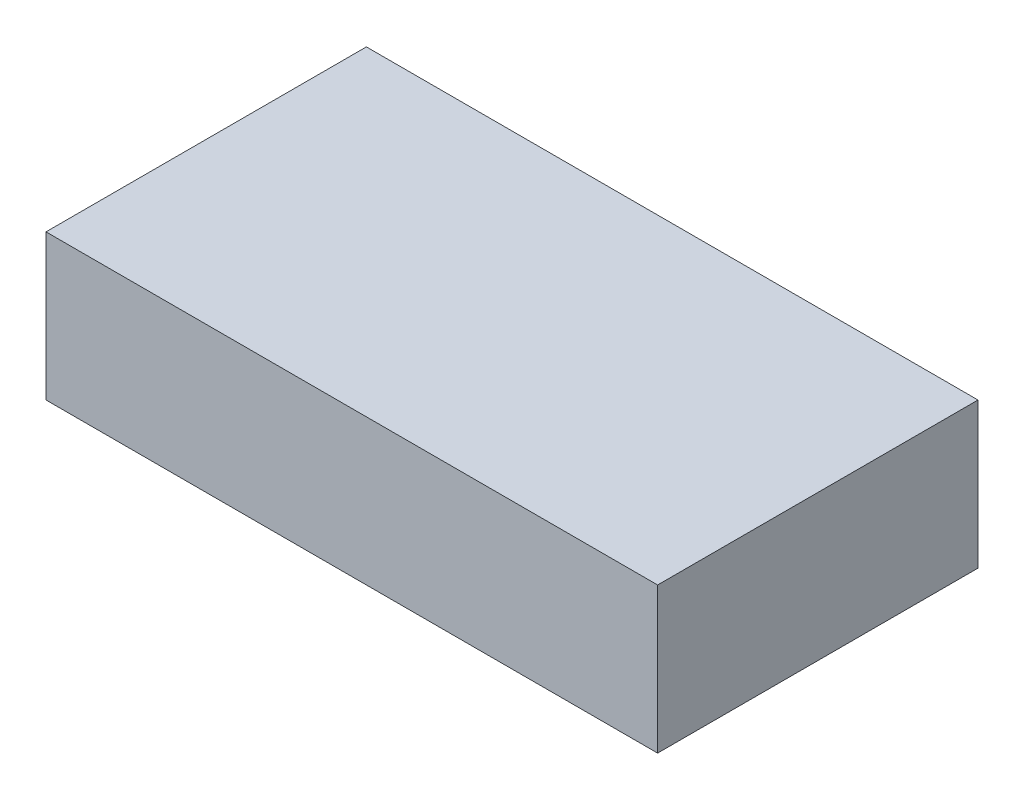
ISO-10303-21;
HEADER;
FILE_DESCRIPTION(('STEP AP214'),'2;1');
FILE_NAME('part.step','',(''),(''),'','','');
FILE_SCHEMA(('AUTOMOTIVE_DESIGN { 1 0 10303 214 1 1 1 1 }'));
ENDSEC;
DATA;
#1=APPLICATION_CONTEXT('core data for automotive mechanical design processes');
#2=APPLICATION_PROTOCOL_DEFINITION('international standard','automotive_design',2000,#1);
#3=PRODUCT_CONTEXT('',#1,'mechanical');
#4=PRODUCT('Part','Part','',(#3));
#5=PRODUCT_RELATED_PRODUCT_CATEGORY('part','',(#4));
#6=PRODUCT_DEFINITION_FORMATION('','',#4);
#7=PRODUCT_DEFINITION_CONTEXT('part definition',#1,'design');
#8=PRODUCT_DEFINITION('design','',#6,#7);
#9=PRODUCT_DEFINITION_SHAPE('','',#8);
#10=(LENGTH_UNIT() NAMED_UNIT(*) SI_UNIT(.MILLI.,.METRE.));
#11=(NAMED_UNIT(*) PLANE_ANGLE_UNIT() SI_UNIT($,.RADIAN.));
#12=(NAMED_UNIT(*) SI_UNIT($,.STERADIAN.) SOLID_ANGLE_UNIT());
#13=UNCERTAINTY_MEASURE_WITH_UNIT(LENGTH_MEASURE(1.E-05),#10,'distance_accuracy_value','');
#14=(GEOMETRIC_REPRESENTATION_CONTEXT(3) GLOBAL_UNCERTAINTY_ASSIGNED_CONTEXT((#13)) GLOBAL_UNIT_ASSIGNED_CONTEXT((#10,
#11,#12)) REPRESENTATION_CONTEXT('',''));
#15=CARTESIAN_POINT('',(0.,0.,0.));
#16=DIRECTION('',(0.,0.,1.));
#17=DIRECTION('',(1.,0.,0.));
#18=AXIS2_PLACEMENT_3D('',#15,#16,#17);
#19=CARTESIAN_POINT('',(0.,25.,-55.));
#20=DIRECTION('',(1.,0.,0.));
#21=DIRECTION('',(0.,0.,-1.));
#22=AXIS2_PLACEMENT_3D('',#19,#20,#21);
#23=PLANE('',#22);
#24=DIRECTION('',(0.,0.,1.));
#25=VECTOR('',#24,1.);
#26=CARTESIAN_POINT('',(0.,0.,-55.));
#27=LINE('',#26,#25);
#28=CARTESIAN_POINT('',(0.,0.,-55.));
#29=VERTEX_POINT('',#28);
#30=CARTESIAN_POINT('',(0.,0.,0.));
#31=VERTEX_POINT('',#30);
#32=EDGE_CURVE('E107',#29,#31,#27,.T.);
#33=ORIENTED_EDGE('',*,*,#32,.T.);
#34=DIRECTION('',(0.,-1.,0.));
#35=VECTOR('',#34,1.);
#36=CARTESIAN_POINT('',(0.,25.,0.));
#37=LINE('',#36,#35);
#38=CARTESIAN_POINT('',(0.,25.,0.));
#39=VERTEX_POINT('',#38);
#40=EDGE_CURVE('E11',#39,#31,#37,.T.);
#41=ORIENTED_EDGE('',*,*,#40,.F.);
#42=DIRECTION('',(0.,0.,1.));
#43=VECTOR('',#42,1.);
#44=CARTESIAN_POINT('',(0.,25.,-55.));
#45=LINE('',#44,#43);
#46=CARTESIAN_POINT('',(0.,25.,-55.));
#47=VERTEX_POINT('',#46);
#48=EDGE_CURVE('E91',#47,#39,#45,.T.);
#49=ORIENTED_EDGE('',*,*,#48,.F.);
#50=DIRECTION('',(0.,-1.,0.));
#51=VECTOR('',#50,1.);
#52=CARTESIAN_POINT('',(0.,25.,-55.));
#53=LINE('',#52,#51);
#54=EDGE_CURVE('E103',#47,#29,#53,.T.);
#55=ORIENTED_EDGE('',*,*,#54,.T.);
#56=EDGE_LOOP('',(#33,#41,#49,#55));
#57=FACE_BOUND('',#56,.T.);
#58=ADVANCED_FACE('F39',(#57),#23,.F.);
#59=CARTESIAN_POINT('',(0.,25.,0.));
#60=DIRECTION('',(0.,0.,-1.));
#61=DIRECTION('',(-1.,0.,0.));
#62=AXIS2_PLACEMENT_3D('',#59,#60,#61);
#63=PLANE('',#62);
#64=DIRECTION('',(1.,0.,0.));
#65=VECTOR('',#64,1.);
#66=CARTESIAN_POINT('',(0.,0.,0.));
#67=LINE('',#66,#65);
#68=CARTESIAN_POINT('',(105.,0.,0.));
#69=VERTEX_POINT('',#68);
#70=EDGE_CURVE('E96',#31,#69,#67,.T.);
#71=ORIENTED_EDGE('',*,*,#70,.T.);
#72=DIRECTION('',(0.,-1.,0.));
#73=VECTOR('',#72,1.);
#74=CARTESIAN_POINT('',(105.,25.,0.));
#75=LINE('',#74,#73);
#76=CARTESIAN_POINT('',(105.,25.,0.));
#77=VERTEX_POINT('',#76);
#78=EDGE_CURVE('E48',#77,#69,#75,.T.);
#79=ORIENTED_EDGE('',*,*,#78,.F.);
#80=DIRECTION('',(1.,0.,0.));
#81=VECTOR('',#80,1.);
#82=CARTESIAN_POINT('',(0.,25.,0.));
#83=LINE('',#82,#81);
#84=EDGE_CURVE('E86',#39,#77,#83,.T.);
#85=ORIENTED_EDGE('',*,*,#84,.F.);
#86=ORIENTED_EDGE('',*,*,#40,.T.);
#87=EDGE_LOOP('',(#71,#79,#85,#86));
#88=FACE_BOUND('',#87,.T.);
#89=ADVANCED_FACE('F95',(#88),#63,.F.);
#90=CARTESIAN_POINT('',(105.,25.,0.));
#91=DIRECTION('',(-1.,0.,0.));
#92=DIRECTION('',(0.,0.,1.));
#93=AXIS2_PLACEMENT_3D('',#90,#91,#92);
#94=PLANE('',#93);
#95=DIRECTION('',(0.,0.,-1.));
#96=VECTOR('',#95,1.);
#97=CARTESIAN_POINT('',(105.,0.,0.));
#98=LINE('',#97,#96);
#99=CARTESIAN_POINT('',(105.,0.,-55.));
#100=VERTEX_POINT('',#99);
#101=EDGE_CURVE('E73',#69,#100,#98,.T.);
#102=ORIENTED_EDGE('',*,*,#101,.T.);
#103=DIRECTION('',(0.,-1.,0.));
#104=VECTOR('',#103,1.);
#105=CARTESIAN_POINT('',(105.,25.,-55.));
#106=LINE('',#105,#104);
#107=CARTESIAN_POINT('',(105.,25.,-55.));
#108=VERTEX_POINT('',#107);
#109=EDGE_CURVE('E98',#108,#100,#106,.T.);
#110=ORIENTED_EDGE('',*,*,#109,.F.);
#111=DIRECTION('',(0.,0.,-1.));
#112=VECTOR('',#111,1.);
#113=CARTESIAN_POINT('',(105.,25.,0.));
#114=LINE('',#113,#112);
#115=EDGE_CURVE('E89',#77,#108,#114,.T.);
#116=ORIENTED_EDGE('',*,*,#115,.F.);
#117=ORIENTED_EDGE('',*,*,#78,.T.);
#118=EDGE_LOOP('',(#102,#110,#116,#117));
#119=FACE_BOUND('',#118,.T.);
#120=ADVANCED_FACE('F99',(#119),#94,.F.);
#121=CARTESIAN_POINT('',(105.,25.,-55.));
#122=DIRECTION('',(0.,0.,1.));
#123=DIRECTION('',(1.,0.,0.));
#124=AXIS2_PLACEMENT_3D('',#121,#122,#123);
#125=PLANE('',#124);
#126=DIRECTION('',(-1.,0.,0.));
#127=VECTOR('',#126,1.);
#128=CARTESIAN_POINT('',(105.,0.,-55.));
#129=LINE('',#128,#127);
#130=EDGE_CURVE('E79',#100,#29,#129,.T.);
#131=ORIENTED_EDGE('',*,*,#130,.T.);
#132=ORIENTED_EDGE('',*,*,#54,.F.);
#133=DIRECTION('',(-1.,0.,0.));
#134=VECTOR('',#133,1.);
#135=CARTESIAN_POINT('',(105.,25.,-55.));
#136=LINE('',#135,#134);
#137=EDGE_CURVE('E56',#108,#47,#136,.T.);
#138=ORIENTED_EDGE('',*,*,#137,.F.);
#139=ORIENTED_EDGE('',*,*,#109,.T.);
#140=EDGE_LOOP('',(#131,#132,#138,#139));
#141=FACE_BOUND('',#140,.T.);
#142=ADVANCED_FACE('F120',(#141),#125,.F.);
#143=CARTESIAN_POINT('',(0.,25.,0.));
#144=DIRECTION('',(0.,1.,0.));
#145=DIRECTION('',(0.,0.,1.));
#146=AXIS2_PLACEMENT_3D('',#143,#144,#145);
#147=PLANE('',#146);
#148=ORIENTED_EDGE('',*,*,#48,.T.);
#149=ORIENTED_EDGE('',*,*,#84,.T.);
#150=ORIENTED_EDGE('',*,*,#115,.T.);
#151=ORIENTED_EDGE('',*,*,#137,.T.);
#152=EDGE_LOOP('',(#148,#149,#150,#151));
#153=FACE_BOUND('',#152,.T.);
#154=ADVANCED_FACE('F87',(#153),#147,.T.);
#155=CARTESIAN_POINT('',(0.,0.,0.));
#156=DIRECTION('',(0.,1.,0.));
#157=DIRECTION('',(0.,0.,1.));
#158=AXIS2_PLACEMENT_3D('',#155,#156,#157);
#159=PLANE('',#158);
#160=ORIENTED_EDGE('',*,*,#32,.F.);
#161=ORIENTED_EDGE('',*,*,#130,.F.);
#162=ORIENTED_EDGE('',*,*,#101,.F.);
#163=ORIENTED_EDGE('',*,*,#70,.F.);
#164=EDGE_LOOP('',(#160,#161,#162,#163));
#165=FACE_BOUND('',#164,.T.);
#166=ADVANCED_FACE('F123',(#165),#159,.F.);
#167=CLOSED_SHELL('',(#58,#89,#120,#142,#154,#166));
#168=MANIFOLD_SOLID_BREP('B2',#167);
#169=ADVANCED_BREP_SHAPE_REPRESENTATION('',(#18,#168),#14);
#170=SHAPE_DEFINITION_REPRESENTATION(#9,#169);
ENDSEC;
END-ISO-10303-21;
